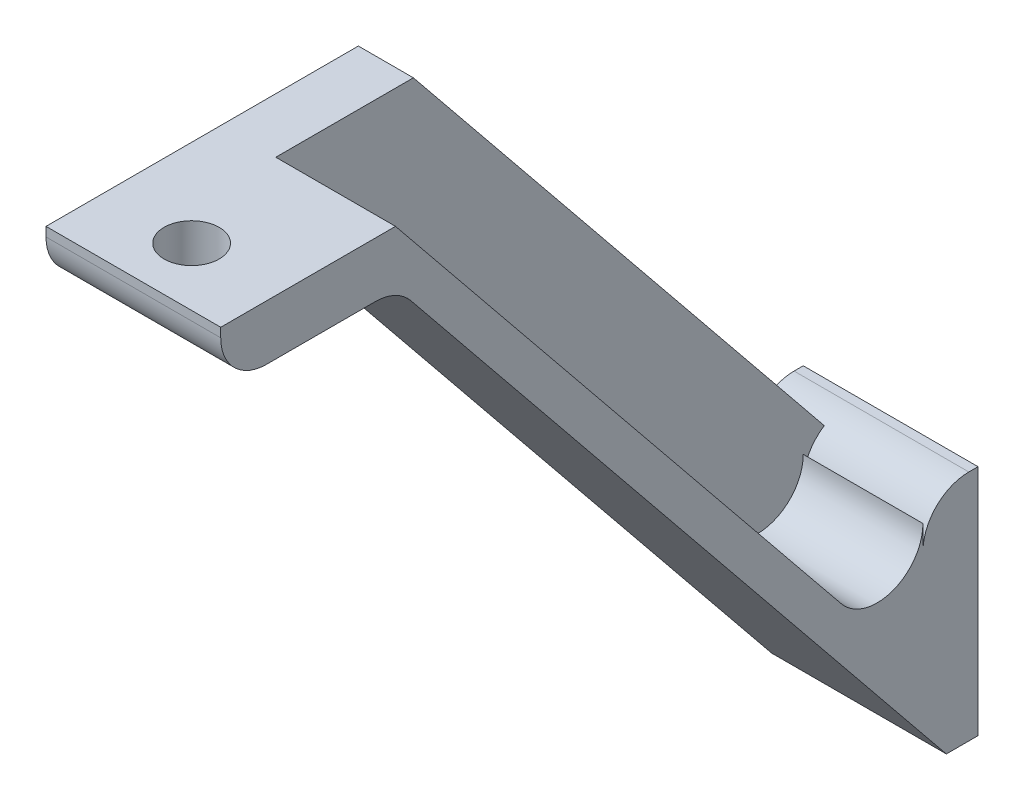
ISO-10303-21;
HEADER;
FILE_DESCRIPTION(('STEP AP214'),'2;1');
FILE_NAME('part.step','',(''),(''),'','','');
FILE_SCHEMA(('AUTOMOTIVE_DESIGN { 1 0 10303 214 1 1 1 1 }'));
ENDSEC;
DATA;
#1=APPLICATION_CONTEXT('core data for automotive mechanical design processes');
#2=APPLICATION_PROTOCOL_DEFINITION('international standard','automotive_design',2000,#1);
#3=PRODUCT_CONTEXT('',#1,'mechanical');
#4=PRODUCT('Part','Part','',(#3));
#5=PRODUCT_RELATED_PRODUCT_CATEGORY('part','',(#4));
#6=PRODUCT_DEFINITION_FORMATION('','',#4);
#7=PRODUCT_DEFINITION_CONTEXT('part definition',#1,'design');
#8=PRODUCT_DEFINITION('design','',#6,#7);
#9=PRODUCT_DEFINITION_SHAPE('','',#8);
#10=(LENGTH_UNIT() NAMED_UNIT(*) SI_UNIT(.MILLI.,.METRE.));
#11=(NAMED_UNIT(*) PLANE_ANGLE_UNIT() SI_UNIT($,.RADIAN.));
#12=(NAMED_UNIT(*) SI_UNIT($,.STERADIAN.) SOLID_ANGLE_UNIT());
#13=UNCERTAINTY_MEASURE_WITH_UNIT(LENGTH_MEASURE(1.E-05),#10,'distance_accuracy_value','');
#14=(GEOMETRIC_REPRESENTATION_CONTEXT(3) GLOBAL_UNCERTAINTY_ASSIGNED_CONTEXT((#13)) GLOBAL_UNIT_ASSIGNED_CONTEXT((#10,
#11,#12)) REPRESENTATION_CONTEXT('',''));
#15=CARTESIAN_POINT('',(0.,0.,0.));
#16=DIRECTION('',(0.,0.,1.));
#17=DIRECTION('',(1.,0.,0.));
#18=AXIS2_PLACEMENT_3D('',#15,#16,#17);
#19=CARTESIAN_POINT('',(19.05,0.,-46.1899559471366));
#20=DIRECTION('',(0.,0.,-1.));
#21=DIRECTION('',(-1.,0.,0.));
#22=AXIS2_PLACEMENT_3D('',#19,#20,#21);
#23=PLANE('',#22);
#24=DIRECTION('',(-1.,0.,0.));
#25=VECTOR('',#24,1.);
#26=CARTESIAN_POINT('',(19.05,-48.4512662104969,-46.1899559471366));
#27=LINE('',#26,#25);
#28=CARTESIAN_POINT('',(19.05,-48.4512662104969,-46.1899559471366));
#29=VERTEX_POINT('',#28);
#30=CARTESIAN_POINT('',(0.,-48.4512662104969,-46.1899559471366));
#31=VERTEX_POINT('',#30);
#32=EDGE_CURVE('E212',#29,#31,#27,.T.);
#33=ORIENTED_EDGE('',*,*,#32,.T.);
#34=DIRECTION('',(0.,-1.,0.));
#35=VECTOR('',#34,1.);
#36=CARTESIAN_POINT('',(0.,0.,-46.1899559471366));
#37=LINE('',#36,#35);
#38=CARTESIAN_POINT('',(0.,-23.0512662104969,-46.1899559471366));
#39=VERTEX_POINT('',#38);
#40=EDGE_CURVE('E180',#39,#31,#37,.T.);
#41=ORIENTED_EDGE('',*,*,#40,.F.);
#42=DIRECTION('',(-1.,0.,0.));
#43=VECTOR('',#42,1.);
#44=CARTESIAN_POINT('',(19.05,-23.0512662104969,-46.1899559471366));
#45=LINE('',#44,#43);
#46=CARTESIAN_POINT('',(19.05,-23.0512662104969,-46.1899559471366));
#47=VERTEX_POINT('',#46);
#48=EDGE_CURVE('E210',#47,#39,#45,.T.);
#49=ORIENTED_EDGE('',*,*,#48,.F.);
#50=DIRECTION('',(0.,-1.,0.));
#51=VECTOR('',#50,1.);
#52=CARTESIAN_POINT('',(19.05,0.,-46.1899559471366));
#53=LINE('',#52,#51);
#54=EDGE_CURVE('E236',#47,#29,#53,.T.);
#55=ORIENTED_EDGE('',*,*,#54,.T.);
#56=EDGE_LOOP('',(#33,#41,#49,#55));
#57=FACE_BOUND('',#56,.T.);
#58=ADVANCED_FACE('F35',(#57),#23,.T.);
#59=CARTESIAN_POINT('',(19.05,-28.0512662104969,-45.1899559471366));
#60=DIRECTION('',(-1.,0.,0.));
#61=DIRECTION('',(0.,0.,1.));
#62=AXIS2_PLACEMENT_3D('',#59,#60,#61);
#63=CYLINDRICAL_SURFACE('',#62,5.);
#64=CARTESIAN_POINT('',(5.99999999999999,-28.0512662104969,-45.1899559471366));
#65=DIRECTION('',(-1.,0.,0.));
#66=DIRECTION('',(0.,-1.,0.));
#67=AXIS2_PLACEMENT_3D('',#64,#65,#66);
#68=CIRCLE('',#67,5.);
#69=CARTESIAN_POINT('',(5.99999999999999,-28.0512662104969,-40.1899559471366));
#70=VERTEX_POINT('',#69);
#71=CARTESIAN_POINT('',(5.99999999999999,-23.8478790133141,-42.4822750075575));
#72=VERTEX_POINT('',#71);
#73=EDGE_CURVE('E293',#70,#72,#68,.T.);
#74=ORIENTED_EDGE('',*,*,#73,.F.);
#75=DIRECTION('',(-1.,0.,0.));
#76=VECTOR('',#75,1.);
#77=CARTESIAN_POINT('',(19.05,-28.0512662104969,-40.1899559471366));
#78=LINE('',#77,#76);
#79=CARTESIAN_POINT('',(19.05,-28.0512662104969,-40.1899559471366));
#80=VERTEX_POINT('',#79);
#81=EDGE_CURVE('E204',#80,#70,#78,.T.);
#82=ORIENTED_EDGE('',*,*,#81,.F.);
#83=CARTESIAN_POINT('',(19.05,-28.0512662104969,-45.1899559471366));
#84=DIRECTION('',(1.,0.,0.));
#85=DIRECTION('',(0.,0.,-1.));
#86=AXIS2_PLACEMENT_3D('',#83,#84,#85);
#87=CIRCLE('',#86,5.);
#88=CARTESIAN_POINT('',(19.05,-23.0512662104969,-45.1899559471366));
#89=VERTEX_POINT('',#88);
#90=EDGE_CURVE('E244',#89,#80,#87,.T.);
#91=ORIENTED_EDGE('',*,*,#90,.F.);
#92=DIRECTION('',(-1.,0.,0.));
#93=VECTOR('',#92,1.);
#94=CARTESIAN_POINT('',(19.05,-23.0512662104969,-45.1899559471366));
#95=LINE('',#94,#93);
#96=CARTESIAN_POINT('',(0.,-23.0512662104969,-45.1899559471366));
#97=VERTEX_POINT('',#96);
#98=EDGE_CURVE('E207',#89,#97,#95,.T.);
#99=ORIENTED_EDGE('',*,*,#98,.T.);
#100=CARTESIAN_POINT('',(0.,-28.0512662104969,-45.1899559471366));
#101=DIRECTION('',(1.,0.,0.));
#102=DIRECTION('',(0.,0.,-1.));
#103=AXIS2_PLACEMENT_3D('',#100,#101,#102);
#104=CIRCLE('',#103,5.);
#105=CARTESIAN_POINT('',(0.,-23.8478790133141,-42.4822750075575));
#106=VERTEX_POINT('',#105);
#107=EDGE_CURVE('E184',#97,#106,#104,.T.);
#108=ORIENTED_EDGE('',*,*,#107,.T.);
#109=DIRECTION('',(-1.,0.,0.));
#110=VECTOR('',#109,1.);
#111=CARTESIAN_POINT('',(19.05,-23.8478790133141,-42.4822750075575));
#112=LINE('',#111,#110);
#113=EDGE_CURVE('E298',#72,#106,#112,.T.);
#114=ORIENTED_EDGE('',*,*,#113,.F.);
#115=EDGE_LOOP('',(#74,#82,#91,#99,#108,#114));
#116=FACE_BOUND('',#115,.T.);
#117=ADVANCED_FACE('F317',(#116),#63,.T.);
#118=CARTESIAN_POINT('',(19.05,0.,-40.1899559471366));
#119=DIRECTION('',(0.,0.,-1.));
#120=DIRECTION('',(-1.,0.,0.));
#121=AXIS2_PLACEMENT_3D('',#118,#119,#120);
#122=PLANE('',#121);
#123=ORIENTED_EDGE('',*,*,#81,.T.);
#124=DIRECTION('',(0.,1.,0.));
#125=VECTOR('',#124,1.);
#126=CARTESIAN_POINT('',(5.99999999999999,0.,-40.1899559471366));
#127=LINE('',#126,#125);
#128=CARTESIAN_POINT('',(5.99999999999999,-25.414192480347,-40.1899559471366));
#129=VERTEX_POINT('',#128);
#130=EDGE_CURVE('E283',#70,#129,#127,.T.);
#131=ORIENTED_EDGE('',*,*,#130,.T.);
#132=DIRECTION('',(-1.,0.,0.));
#133=VECTOR('',#132,1.);
#134=CARTESIAN_POINT('',(19.05,-25.414192480347,-40.1899559471366));
#135=LINE('',#134,#133);
#136=CARTESIAN_POINT('',(19.05,-25.414192480347,-40.1899559471366));
#137=VERTEX_POINT('',#136);
#138=EDGE_CURVE('E201',#137,#129,#135,.T.);
#139=ORIENTED_EDGE('',*,*,#138,.F.);
#140=DIRECTION('',(0.,-1.,0.));
#141=VECTOR('',#140,1.);
#142=CARTESIAN_POINT('',(19.05,0.,-40.1899559471366));
#143=LINE('',#142,#141);
#144=EDGE_CURVE('E246',#137,#80,#143,.T.);
#145=ORIENTED_EDGE('',*,*,#144,.T.);
#146=EDGE_LOOP('',(#123,#131,#139,#145));
#147=FACE_BOUND('',#146,.T.);
#148=ADVANCED_FACE('F331',(#147),#122,.T.);
#149=CARTESIAN_POINT('',(19.05,-25.4141924803471,-35.1899559471366));
#150=DIRECTION('',(-1.,0.,0.));
#151=DIRECTION('',(0.,0.,1.));
#152=AXIS2_PLACEMENT_3D('',#149,#150,#151);
#153=CYLINDRICAL_SURFACE('',#152,5.);
#154=ORIENTED_EDGE('',*,*,#138,.T.);
#155=CARTESIAN_POINT('',(5.99999999999999,-25.4141924803471,-35.1899559471366));
#156=DIRECTION('',(-1.,0.,0.));
#157=DIRECTION('',(0.,-1.,0.));
#158=AXIS2_PLACEMENT_3D('',#155,#156,#157);
#159=CIRCLE('',#158,5.);
#160=CARTESIAN_POINT('',(5.99999999999999,-28.5635337516095,-31.3064459938697));
#161=VERTEX_POINT('',#160);
#162=EDGE_CURVE('E296',#129,#161,#159,.T.);
#163=ORIENTED_EDGE('',*,*,#162,.T.);
#164=DIRECTION('',(-1.,0.,0.));
#165=VECTOR('',#164,1.);
#166=CARTESIAN_POINT('',(19.05,-28.5635337516095,-31.3064459938697));
#167=LINE('',#166,#165);
#168=CARTESIAN_POINT('',(19.05,-28.5635337516095,-31.3064459938697));
#169=VERTEX_POINT('',#168);
#170=EDGE_CURVE('E198',#169,#161,#167,.T.);
#171=ORIENTED_EDGE('',*,*,#170,.F.);
#172=CARTESIAN_POINT('',(19.05,-25.4141924803471,-35.1899559471366));
#173=DIRECTION('',(1.,0.,0.));
#174=DIRECTION('',(0.,0.,-1.));
#175=AXIS2_PLACEMENT_3D('',#172,#173,#174);
#176=CIRCLE('',#175,5.);
#177=EDGE_CURVE('E164',#169,#137,#176,.T.);
#178=ORIENTED_EDGE('',*,*,#177,.T.);
#179=EDGE_LOOP('',(#154,#163,#171,#178));
#180=FACE_BOUND('',#179,.T.);
#181=ADVANCED_FACE('F250',(#180),#153,.F.);
#182=CARTESIAN_POINT('',(19.05,3.98361171605755,-4.91226399959472));
#183=DIRECTION('',(0.,0.629868254252483,-0.776701990653384));
#184=DIRECTION('',(0.,0.776701990653384,0.629868254252483));
#185=AXIS2_PLACEMENT_3D('',#182,#183,#184);
#186=PLANE('',#185);
#187=ORIENTED_EDGE('',*,*,#170,.T.);
#188=DIRECTION('',(0.,-0.776701990653384,-0.629868254252483));
#189=VECTOR('',#188,1.);
#190=CARTESIAN_POINT('',(6.,31.3863436123348,17.3100440528634));
#191=LINE('',#190,#189);
#192=CARTESIAN_POINT('',(6.,31.3863436123348,17.3100440528634));
#193=VERTEX_POINT('',#192);
#194=EDGE_CURVE('E260',#193,#161,#191,.T.);
#195=ORIENTED_EDGE('',*,*,#194,.F.);
#196=DIRECTION('',(-1.,0.,0.));
#197=VECTOR('',#196,1.);
#198=CARTESIAN_POINT('',(19.05,31.3863436123348,17.3100440528634));
#199=LINE('',#198,#197);
#200=CARTESIAN_POINT('',(19.05,31.3863436123348,17.3100440528634));
#201=VERTEX_POINT('',#200);
#202=EDGE_CURVE('E150',#201,#193,#199,.T.);
#203=ORIENTED_EDGE('',*,*,#202,.F.);
#204=DIRECTION('',(0.,-0.776701990653384,-0.629868254252483));
#205=VECTOR('',#204,1.);
#206=CARTESIAN_POINT('',(19.05,3.98361171605755,-4.91226399959472));
#207=LINE('',#206,#205);
#208=EDGE_CURVE('E162',#201,#169,#207,.T.);
#209=ORIENTED_EDGE('',*,*,#208,.T.);
#210=EDGE_LOOP('',(#187,#195,#203,#209));
#211=FACE_BOUND('',#210,.T.);
#212=ADVANCED_FACE('F255',(#211),#186,.T.);
#213=CARTESIAN_POINT('',(19.05,25.3863436123348,0.));
#214=DIRECTION('',(0.,1.,0.));
#215=DIRECTION('',(0.,0.,1.));
#216=AXIS2_PLACEMENT_3D('',#213,#214,#215);
#217=PLANE('',#216);
#218=DIRECTION('',(-1.,0.,0.));
#219=VECTOR('',#218,1.);
#220=CARTESIAN_POINT('',(19.05,25.3863436123348,31.3600440528635));
#221=LINE('',#220,#219);
#222=CARTESIAN_POINT('',(19.05,25.3863436123348,31.3600440528635));
#223=VERTEX_POINT('',#222);
#224=CARTESIAN_POINT('',(12.2040856649237,25.3863436123348,31.3600440528635));
#225=VERTEX_POINT('',#224);
#226=EDGE_CURVE('E193',#223,#225,#221,.T.);
#227=ORIENTED_EDGE('',*,*,#226,.T.);
#228=CARTESIAN_POINT('',(9.525,25.3863436123348,30.0100440528634));
#229=DIRECTION('',(0.,1.,0.));
#230=DIRECTION('',(0.,0.,1.));
#231=AXIS2_PLACEMENT_3D('',#228,#229,#230);
#232=CIRCLE('',#231,3.);
#233=CARTESIAN_POINT('',(6.84591433507626,25.3863436123348,31.3600440528635));
#234=VERTEX_POINT('',#233);
#235=EDGE_CURVE('E54',#225,#234,#232,.T.);
#236=ORIENTED_EDGE('',*,*,#235,.T.);
#237=CARTESIAN_POINT('',(0.,25.3863436123348,31.3600440528635));
#238=VERTEX_POINT('',#237);
#239=EDGE_CURVE('E98',#234,#238,#221,.T.);
#240=ORIENTED_EDGE('',*,*,#239,.T.);
#241=DIRECTION('',(0.,0.,-1.));
#242=VECTOR('',#241,1.);
#243=CARTESIAN_POINT('',(0.,25.3863436123348,0.));
#244=LINE('',#243,#242);
#245=CARTESIAN_POINT('',(0.,25.3863436123348,19.5211518854618));
#246=VERTEX_POINT('',#245);
#247=EDGE_CURVE('E169',#238,#246,#244,.T.);
#248=ORIENTED_EDGE('',*,*,#247,.T.);
#249=DIRECTION('',(-1.,0.,0.));
#250=VECTOR('',#249,1.);
#251=CARTESIAN_POINT('',(19.05,25.3863436123348,19.5211518854618));
#252=LINE('',#251,#250);
#253=CARTESIAN_POINT('',(19.05,25.3863436123348,19.5211518854618));
#254=VERTEX_POINT('',#253);
#255=EDGE_CURVE('E48',#254,#246,#252,.T.);
#256=ORIENTED_EDGE('',*,*,#255,.F.);
#257=DIRECTION('',(0.,0.,-1.));
#258=VECTOR('',#257,1.);
#259=CARTESIAN_POINT('',(19.05,25.3863436123348,0.));
#260=LINE('',#259,#258);
#261=EDGE_CURVE('E192',#223,#254,#260,.T.);
#262=ORIENTED_EDGE('',*,*,#261,.F.);
#263=EDGE_LOOP('',(#227,#236,#240,#248,#256,#262));
#264=FACE_BOUND('',#263,.T.);
#265=ADVANCED_FACE('F37',(#264),#217,.F.);
#266=CARTESIAN_POINT('',(19.05,20.3863436123348,19.5211518854618));
#267=DIRECTION('',(-1.,0.,0.));
#268=DIRECTION('',(0.,0.,1.));
#269=AXIS2_PLACEMENT_3D('',#266,#267,#268);
#270=CYLINDRICAL_SURFACE('',#269,5.);
#271=CARTESIAN_POINT('',(0.,20.3863436123348,19.5211518854618));
#272=DIRECTION('',(1.,0.,0.));
#273=DIRECTION('',(0.,0.,-1.));
#274=AXIS2_PLACEMENT_3D('',#271,#272,#273);
#275=CIRCLE('',#274,5.);
#276=CARTESIAN_POINT('',(0.,23.5356848835972,15.6376419321949));
#277=VERTEX_POINT('',#276);
#278=EDGE_CURVE('E171',#246,#277,#275,.F.);
#279=ORIENTED_EDGE('',*,*,#278,.T.);
#280=DIRECTION('',(-1.,0.,0.));
#281=VECTOR('',#280,1.);
#282=CARTESIAN_POINT('',(19.05,23.5356848835972,15.6376419321949));
#283=LINE('',#282,#281);
#284=CARTESIAN_POINT('',(19.05,23.5356848835972,15.6376419321949));
#285=VERTEX_POINT('',#284);
#286=EDGE_CURVE('E217',#285,#277,#283,.T.);
#287=ORIENTED_EDGE('',*,*,#286,.F.);
#288=CARTESIAN_POINT('',(19.05,20.3863436123348,19.5211518854618));
#289=DIRECTION('',(1.,0.,0.));
#290=DIRECTION('',(0.,0.,-1.));
#291=AXIS2_PLACEMENT_3D('',#288,#289,#290);
#292=CIRCLE('',#291,5.);
#293=EDGE_CURVE('E107',#254,#285,#292,.F.);
#294=ORIENTED_EDGE('',*,*,#293,.F.);
#295=ORIENTED_EDGE('',*,*,#255,.T.);
#296=EDGE_LOOP('',(#279,#287,#294,#295));
#297=FACE_BOUND('',#296,.T.);
#298=ADVANCED_FACE('F219',(#297),#270,.F.);
#299=CARTESIAN_POINT('',(19.05,1.68716078016194,-2.0804686180911));
#300=DIRECTION('',(0.,-0.629868254252477,0.776701990653389));
#301=DIRECTION('',(0.,-0.776701990653389,-0.629868254252477));
#302=AXIS2_PLACEMENT_3D('',#299,#300,#301);
#303=PLANE('',#302);
#304=DIRECTION('',(0.,0.776701990653389,0.629868254252477));
#305=VECTOR('',#304,1.);
#306=CARTESIAN_POINT('',(0.,1.68716078016194,-2.0804686180911));
#307=LINE('',#306,#305);
#308=CARTESIAN_POINT('',(0.,-48.4512662104969,-42.7403405633205));
#309=VERTEX_POINT('',#308);
#310=EDGE_CURVE('E174',#309,#277,#307,.T.);
#311=ORIENTED_EDGE('',*,*,#310,.F.);
#312=DIRECTION('',(-1.,0.,0.));
#313=VECTOR('',#312,1.);
#314=CARTESIAN_POINT('',(19.05,-48.4512662104969,-42.7403405633205));
#315=LINE('',#314,#313);
#316=CARTESIAN_POINT('',(19.05,-48.4512662104969,-42.7403405633205));
#317=VERTEX_POINT('',#316);
#318=EDGE_CURVE('E215',#317,#309,#315,.T.);
#319=ORIENTED_EDGE('',*,*,#318,.F.);
#320=DIRECTION('',(0.,0.776701990653389,0.629868254252477));
#321=VECTOR('',#320,1.);
#322=CARTESIAN_POINT('',(19.05,1.68716078016194,-2.0804686180911));
#323=LINE('',#322,#321);
#324=EDGE_CURVE('E232',#317,#285,#323,.T.);
#325=ORIENTED_EDGE('',*,*,#324,.T.);
#326=ORIENTED_EDGE('',*,*,#286,.T.);
#327=EDGE_LOOP('',(#311,#319,#325,#326));
#328=FACE_BOUND('',#327,.T.);
#329=ADVANCED_FACE('F228',(#328),#303,.T.);
#330=CARTESIAN_POINT('',(19.05,-48.4512662104969,0.));
#331=DIRECTION('',(0.,1.,0.));
#332=DIRECTION('',(0.,0.,1.));
#333=AXIS2_PLACEMENT_3D('',#330,#331,#332);
#334=PLANE('',#333);
#335=DIRECTION('',(0.,0.,-1.));
#336=VECTOR('',#335,1.);
#337=CARTESIAN_POINT('',(0.,-48.4512662104969,0.));
#338=LINE('',#337,#336);
#339=EDGE_CURVE('E177',#309,#31,#338,.T.);
#340=ORIENTED_EDGE('',*,*,#339,.T.);
#341=ORIENTED_EDGE('',*,*,#32,.F.);
#342=DIRECTION('',(0.,0.,-1.));
#343=VECTOR('',#342,1.);
#344=CARTESIAN_POINT('',(19.05,-48.4512662104969,0.));
#345=LINE('',#344,#343);
#346=EDGE_CURVE('E234',#317,#29,#345,.T.);
#347=ORIENTED_EDGE('',*,*,#346,.F.);
#348=ORIENTED_EDGE('',*,*,#318,.T.);
#349=EDGE_LOOP('',(#340,#341,#347,#348));
#350=FACE_BOUND('',#349,.T.);
#351=ADVANCED_FACE('F329',(#350),#334,.F.);
#352=CARTESIAN_POINT('',(19.05,-23.0512662104969,0.));
#353=DIRECTION('',(0.,-1.,0.));
#354=DIRECTION('',(0.,0.,-1.));
#355=AXIS2_PLACEMENT_3D('',#352,#353,#354);
#356=PLANE('',#355);
#357=DIRECTION('',(0.,0.,1.));
#358=VECTOR('',#357,1.);
#359=CARTESIAN_POINT('',(0.,-23.0512662104969,0.));
#360=LINE('',#359,#358);
#361=EDGE_CURVE('E182',#39,#97,#360,.T.);
#362=ORIENTED_EDGE('',*,*,#361,.T.);
#363=ORIENTED_EDGE('',*,*,#98,.F.);
#364=DIRECTION('',(0.,0.,1.));
#365=VECTOR('',#364,1.);
#366=CARTESIAN_POINT('',(19.05,-23.0512662104969,0.));
#367=LINE('',#366,#365);
#368=EDGE_CURVE('E242',#47,#89,#367,.T.);
#369=ORIENTED_EDGE('',*,*,#368,.F.);
#370=ORIENTED_EDGE('',*,*,#48,.T.);
#371=EDGE_LOOP('',(#362,#363,#369,#370));
#372=FACE_BOUND('',#371,.T.);
#373=ADVANCED_FACE('F323',(#372),#356,.F.);
#374=CARTESIAN_POINT('',(19.05,31.3863436123348,0.));
#375=DIRECTION('',(0.,1.,0.));
#376=DIRECTION('',(0.,0.,1.));
#377=AXIS2_PLACEMENT_3D('',#374,#375,#376);
#378=PLANE('',#377);
#379=CARTESIAN_POINT('',(9.525,31.3863436123348,30.0100440528634));
#380=DIRECTION('',(0.,1.,0.));
#381=DIRECTION('',(0.,0.,1.));
#382=AXIS2_PLACEMENT_3D('',#379,#380,#381);
#383=CIRCLE('',#382,3.);
#384=CARTESIAN_POINT('',(9.525,31.3863436123348,33.0100440528634));
#385=VERTEX_POINT('',#384);
#386=EDGE_CURVE('E287',#385,#385,#383,.T.);
#387=ORIENTED_EDGE('',*,*,#386,.F.);
#388=EDGE_LOOP('',(#387));
#389=FACE_BOUND('',#388,.T.);
#390=DIRECTION('',(0.,0.,-1.));
#391=VECTOR('',#390,1.);
#392=CARTESIAN_POINT('',(0.,31.3863436123348,0.));
#393=LINE('',#392,#391);
#394=CARTESIAN_POINT('',(0.,31.3863436123348,36.3600440528635));
#395=VERTEX_POINT('',#394);
#396=CARTESIAN_POINT('',(0.,31.3863436123348,2.31004405286344));
#397=VERTEX_POINT('',#396);
#398=EDGE_CURVE('E147',#395,#397,#393,.T.);
#399=ORIENTED_EDGE('',*,*,#398,.F.);
#400=DIRECTION('',(-1.,0.,0.));
#401=VECTOR('',#400,1.);
#402=CARTESIAN_POINT('',(19.05,31.3863436123348,36.3600440528635));
#403=LINE('',#402,#401);
#404=CARTESIAN_POINT('',(19.05,31.3863436123348,36.3600440528635));
#405=VERTEX_POINT('',#404);
#406=EDGE_CURVE('E139',#405,#395,#403,.T.);
#407=ORIENTED_EDGE('',*,*,#406,.F.);
#408=DIRECTION('',(0.,0.,-1.));
#409=VECTOR('',#408,1.);
#410=CARTESIAN_POINT('',(19.05,31.3863436123348,0.));
#411=LINE('',#410,#409);
#412=EDGE_CURVE('E144',#405,#201,#411,.T.);
#413=ORIENTED_EDGE('',*,*,#412,.T.);
#414=ORIENTED_EDGE('',*,*,#202,.T.);
#415=DIRECTION('',(0.,0.,1.));
#416=VECTOR('',#415,1.);
#417=CARTESIAN_POINT('',(6.,31.3863436123348,2.31004405286344));
#418=LINE('',#417,#416);
#419=CARTESIAN_POINT('',(6.,31.3863436123348,2.31004405286344));
#420=VERTEX_POINT('',#419);
#421=EDGE_CURVE('E264',#420,#193,#418,.T.);
#422=ORIENTED_EDGE('',*,*,#421,.F.);
#423=DIRECTION('',(1.,0.,0.));
#424=VECTOR('',#423,1.);
#425=CARTESIAN_POINT('',(0.,31.3863436123348,2.31004405286344));
#426=LINE('',#425,#424);
#427=EDGE_CURVE('E306',#397,#420,#426,.T.);
#428=ORIENTED_EDGE('',*,*,#427,.F.);
#429=EDGE_LOOP('',(#399,#407,#413,#414,#422,#428));
#430=FACE_BOUND('',#429,.T.);
#431=ADVANCED_FACE('F141',(#389,#430),#378,.T.);
#432=CARTESIAN_POINT('',(19.05,0.,36.3600440528635));
#433=DIRECTION('',(0.,0.,-1.));
#434=DIRECTION('',(-1.,0.,0.));
#435=AXIS2_PLACEMENT_3D('',#432,#433,#434);
#436=PLANE('',#435);
#437=DIRECTION('',(0.,-1.,0.));
#438=VECTOR('',#437,1.);
#439=CARTESIAN_POINT('',(0.,0.,36.3600440528635));
#440=LINE('',#439,#438);
#441=CARTESIAN_POINT('',(0.,30.3863436123348,36.3600440528635));
#442=VERTEX_POINT('',#441);
#443=EDGE_CURVE('E188',#395,#442,#440,.T.);
#444=ORIENTED_EDGE('',*,*,#443,.T.);
#445=DIRECTION('',(-1.,0.,0.));
#446=VECTOR('',#445,1.);
#447=CARTESIAN_POINT('',(19.05,30.3863436123348,36.3600440528635));
#448=LINE('',#447,#446);
#449=CARTESIAN_POINT('',(19.05,30.3863436123348,36.3600440528635));
#450=VERTEX_POINT('',#449);
#451=EDGE_CURVE('E151',#450,#442,#448,.T.);
#452=ORIENTED_EDGE('',*,*,#451,.F.);
#453=DIRECTION('',(0.,-1.,0.));
#454=VECTOR('',#453,1.);
#455=CARTESIAN_POINT('',(19.05,0.,36.3600440528635));
#456=LINE('',#455,#454);
#457=EDGE_CURVE('E154',#405,#450,#456,.T.);
#458=ORIENTED_EDGE('',*,*,#457,.F.);
#459=ORIENTED_EDGE('',*,*,#406,.T.);
#460=EDGE_LOOP('',(#444,#452,#458,#459));
#461=FACE_BOUND('',#460,.T.);
#462=ADVANCED_FACE('F155',(#461),#436,.F.);
#463=CARTESIAN_POINT('',(19.05,30.3863436123348,31.3600440528635));
#464=DIRECTION('',(-1.,0.,0.));
#465=DIRECTION('',(0.,0.,1.));
#466=AXIS2_PLACEMENT_3D('',#463,#464,#465);
#467=CYLINDRICAL_SURFACE('',#466,5.);
#468=ORIENTED_EDGE('',*,*,#239,.F.);
#469=CARTESIAN_POINT('',(6.84591433507626,25.3863436123348,31.3600440528635));
#470=CARTESIAN_POINT('',(6.88298809357243,25.3863345061108,31.43364259781));
#471=CARTESIAN_POINT('',(6.92310376753372,25.3879683601489,31.5056821488882));
#472=CARTESIAN_POINT('',(7.00903450181283,25.3940410833055,31.6460974055983));
#473=CARTESIAN_POINT('',(7.0548461073016,25.3984782586903,31.7144752965208));
#474=CARTESIAN_POINT('',(7.15168600278105,25.409661250056,31.8469146656418));
#475=CARTESIAN_POINT('',(7.20269841097467,25.4164001769796,31.9109883491352));
#476=CARTESIAN_POINT('',(7.30965732944087,25.4316673271612,32.0346296030605));
#477=CARTESIAN_POINT('',(7.36560451314251,25.4401957948505,32.0941965564102));
#478=CARTESIAN_POINT('',(7.54006936942364,25.4676347505701,32.2653746542719));
#479=CARTESIAN_POINT('',(7.66547203432026,25.4884341776462,32.3698194511588));
#480=CARTESIAN_POINT('',(7.93145427020408,25.5307810718725,32.5570274768693));
#481=CARTESIAN_POINT('',(8.07204605546218,25.552329131444,32.6397730703487));
#482=CARTESIAN_POINT('',(8.37156519063775,25.5929695385672,32.7846451797778));
#483=CARTESIAN_POINT('',(8.53102238008411,25.6119155009414,32.8457259845575));
#484=CARTESIAN_POINT('',(8.85860869053517,25.6422871784494,32.9400515893843));
#485=CARTESIAN_POINT('',(9.02673292567573,25.6537170816747,32.9733118943601));
#486=CARTESIAN_POINT('',(9.36076198093896,25.6664161106513,33.0100908449573));
#487=CARTESIAN_POINT('',(9.52654601173637,25.6680194151194,33.0145878962413));
#488=CARTESIAN_POINT('',(9.85639063756639,25.6616318945915,32.9962558536263));
#489=CARTESIAN_POINT('',(10.0204513597817,25.6536417826938,32.9734287907853));
#490=CARTESIAN_POINT('',(10.3368320948119,25.6300737533156,32.9025141936981));
#491=CARTESIAN_POINT('',(10.4893598681404,25.6147471951888,32.8552595825877));
#492=CARTESIAN_POINT('',(10.7846099766438,25.5794159165364,32.7374363639396));
#493=CARTESIAN_POINT('',(10.9273265384719,25.5594084715483,32.6668541689088));
#494=CARTESIAN_POINT('',(11.2063580094751,25.5172734105186,32.5001699469584));
#495=CARTESIAN_POINT('',(11.342021505101,25.495089983764,32.4029914261568));
#496=CARTESIAN_POINT('',(11.5955725750204,25.4540337637781,32.1872840248751));
#497=CARTESIAN_POINT('',(11.7134810632759,25.4351570711307,32.0687806304858));
#498=CARTESIAN_POINT('',(11.8955448903779,25.4098350919691,31.8523166039889));
#499=CARTESIAN_POINT('',(11.9651264365734,25.4013542275838,31.7591143958761));
#500=CARTESIAN_POINT('',(12.0931913740003,25.3895935443512,31.5650246709532));
#501=CARTESIAN_POINT('',(12.1516698020756,25.3863160466418,31.4641337453495));
#502=CARTESIAN_POINT('',(12.2040856649237,25.3863436123348,31.3600440528635));
#503=B_SPLINE_CURVE_WITH_KNOTS('',3,(#469,#470,#471,#472,#473,#474,#475,#476,#477,#478,#479,
#480,#481,#482,#483,#484,#485,#486,#487,#488,#489,#490,#491,#492,#493,#494,#495,#496,#497,#498,
#499,#500,#501,#502),.UNSPECIFIED.,.F.,.F.,(4,2,2,2,2,2,2,2,2,2,2,2,2,2,2,2,4),(0.,
0.247104339659242,0.494059524388488,0.740281965616051,0.986538059975356,1.47773578192606,
1.96933148076431,2.48217374188199,2.99472999480814,3.48975414608641,3.98474150348001,
4.46386679413027,4.94327165161105,5.44605122760362,5.9482338576443,6.29724895877355,
6.64641970619571),.UNSPECIFIED.);
#504=EDGE_CURVE('E11',#234,#225,#503,.T.);
#505=ORIENTED_EDGE('',*,*,#504,.T.);
#506=ORIENTED_EDGE('',*,*,#226,.F.);
#507=CARTESIAN_POINT('',(19.05,30.3863436123348,31.3600440528635));
#508=DIRECTION('',(1.,0.,0.));
#509=DIRECTION('',(0.,0.,-1.));
#510=AXIS2_PLACEMENT_3D('',#507,#508,#509);
#511=CIRCLE('',#510,5.);
#512=EDGE_CURVE('E62',#450,#223,#511,.T.);
#513=ORIENTED_EDGE('',*,*,#512,.F.);
#514=ORIENTED_EDGE('',*,*,#451,.T.);
#515=CARTESIAN_POINT('',(0.,30.3863436123348,31.3600440528635));
#516=DIRECTION('',(1.,0.,0.));
#517=DIRECTION('',(0.,0.,-1.));
#518=AXIS2_PLACEMENT_3D('',#515,#516,#517);
#519=CIRCLE('',#518,5.);
#520=EDGE_CURVE('E190',#442,#238,#519,.T.);
#521=ORIENTED_EDGE('',*,*,#520,.T.);
#522=EDGE_LOOP('',(#468,#505,#506,#513,#514,#521));
#523=FACE_BOUND('',#522,.T.);
#524=ADVANCED_FACE('F289',(#523),#467,.T.);
#525=CARTESIAN_POINT('',(19.05,0.,0.));
#526=DIRECTION('',(1.,0.,0.));
#527=DIRECTION('',(0.,0.,-1.));
#528=AXIS2_PLACEMENT_3D('',#525,#526,#527);
#529=PLANE('',#528);
#530=ORIENTED_EDGE('',*,*,#261,.T.);
#531=ORIENTED_EDGE('',*,*,#293,.T.);
#532=ORIENTED_EDGE('',*,*,#324,.F.);
#533=ORIENTED_EDGE('',*,*,#346,.T.);
#534=ORIENTED_EDGE('',*,*,#54,.F.);
#535=ORIENTED_EDGE('',*,*,#368,.T.);
#536=ORIENTED_EDGE('',*,*,#90,.T.);
#537=ORIENTED_EDGE('',*,*,#144,.F.);
#538=ORIENTED_EDGE('',*,*,#177,.F.);
#539=ORIENTED_EDGE('',*,*,#208,.F.);
#540=ORIENTED_EDGE('',*,*,#412,.F.);
#541=ORIENTED_EDGE('',*,*,#457,.T.);
#542=ORIENTED_EDGE('',*,*,#512,.T.);
#543=EDGE_LOOP('',(#530,#531,#532,#533,#534,#535,#536,#537,#538,#539,#540,#541,#542));
#544=FACE_BOUND('',#543,.T.);
#545=ADVANCED_FACE('F159',(#544),#529,.T.);
#546=CARTESIAN_POINT('',(0.,0.,0.));
#547=DIRECTION('',(1.,0.,0.));
#548=DIRECTION('',(0.,0.,-1.));
#549=AXIS2_PLACEMENT_3D('',#546,#547,#548);
#550=PLANE('',#549);
#551=ORIENTED_EDGE('',*,*,#40,.T.);
#552=ORIENTED_EDGE('',*,*,#339,.F.);
#553=ORIENTED_EDGE('',*,*,#310,.T.);
#554=ORIENTED_EDGE('',*,*,#278,.F.);
#555=ORIENTED_EDGE('',*,*,#247,.F.);
#556=ORIENTED_EDGE('',*,*,#520,.F.);
#557=ORIENTED_EDGE('',*,*,#443,.F.);
#558=ORIENTED_EDGE('',*,*,#398,.T.);
#559=DIRECTION('',(0.,0.776701990653384,0.629868254252483));
#560=VECTOR('',#559,1.);
#561=CARTESIAN_POINT('',(0.,31.3863436123348,2.31004405286344));
#562=LINE('',#561,#560);
#563=EDGE_CURVE('E303',#106,#397,#562,.T.);
#564=ORIENTED_EDGE('',*,*,#563,.F.);
#565=ORIENTED_EDGE('',*,*,#107,.F.);
#566=ORIENTED_EDGE('',*,*,#361,.F.);
#567=EDGE_LOOP('',(#551,#552,#553,#554,#555,#556,#557,#558,#564,#565,#566));
#568=FACE_BOUND('',#567,.T.);
#569=ADVANCED_FACE('F224',(#568),#550,.F.);
#570=CARTESIAN_POINT('',(9.525,12.3363436123348,30.0100440528634));
#571=DIRECTION('',(0.,1.,0.));
#572=DIRECTION('',(0.,0.,1.));
#573=AXIS2_PLACEMENT_3D('',#570,#571,#572);
#574=CYLINDRICAL_SURFACE('',#573,3.);
#575=ORIENTED_EDGE('',*,*,#386,.T.);
#576=EDGE_LOOP('',(#575));
#577=FACE_BOUND('',#576,.T.);
#578=ORIENTED_EDGE('',*,*,#504,.F.);
#579=ORIENTED_EDGE('',*,*,#235,.F.);
#580=EDGE_LOOP('',(#578,#579));
#581=FACE_BOUND('',#580,.T.);
#582=ADVANCED_FACE('F285',(#577,#581),#574,.F.);
#583=CARTESIAN_POINT('',(6.,31.3863436123348,2.31004405286344));
#584=DIRECTION('',(-1.,0.,0.));
#585=DIRECTION('',(0.,-1.,0.));
#586=AXIS2_PLACEMENT_3D('',#583,#584,#585);
#587=PLANE('',#586);
#588=ORIENTED_EDGE('',*,*,#130,.F.);
#589=ORIENTED_EDGE('',*,*,#73,.T.);
#590=DIRECTION('',(0.,-0.776701990653384,-0.629868254252483));
#591=VECTOR('',#590,1.);
#592=CARTESIAN_POINT('',(6.,31.3863436123348,2.31004405286344));
#593=LINE('',#592,#591);
#594=EDGE_CURVE('E301',#420,#72,#593,.T.);
#595=ORIENTED_EDGE('',*,*,#594,.F.);
#596=ORIENTED_EDGE('',*,*,#421,.T.);
#597=ORIENTED_EDGE('',*,*,#194,.T.);
#598=ORIENTED_EDGE('',*,*,#162,.F.);
#599=EDGE_LOOP('',(#588,#589,#595,#596,#597,#598));
#600=FACE_BOUND('',#599,.T.);
#601=ADVANCED_FACE('F373',(#600),#587,.F.);
#602=CARTESIAN_POINT('',(0.,3.98361171605755,-19.9122639995947));
#603=DIRECTION('',(0.,-0.629868254252483,0.776701990653384));
#604=DIRECTION('',(0.,-0.776701990653384,-0.629868254252483));
#605=AXIS2_PLACEMENT_3D('',#602,#603,#604);
#606=PLANE('',#605);
#607=ORIENTED_EDGE('',*,*,#594,.T.);
#608=ORIENTED_EDGE('',*,*,#113,.T.);
#609=ORIENTED_EDGE('',*,*,#563,.T.);
#610=ORIENTED_EDGE('',*,*,#427,.T.);
#611=EDGE_LOOP('',(#607,#608,#609,#610));
#612=FACE_BOUND('',#611,.T.);
#613=ADVANCED_FACE('F312',(#612),#606,.F.);
#614=CLOSED_SHELL('',(#58,#117,#148,#181,#212,#265,#298,#329,#351,#373,#431,#462,#524,#545,#569,
#582,#601,#613));
#615=MANIFOLD_SOLID_BREP('B2',#614);
#616=ADVANCED_BREP_SHAPE_REPRESENTATION('',(#18,#615),#14);
#617=SHAPE_DEFINITION_REPRESENTATION(#9,#616);
ENDSEC;
END-ISO-10303-21;
